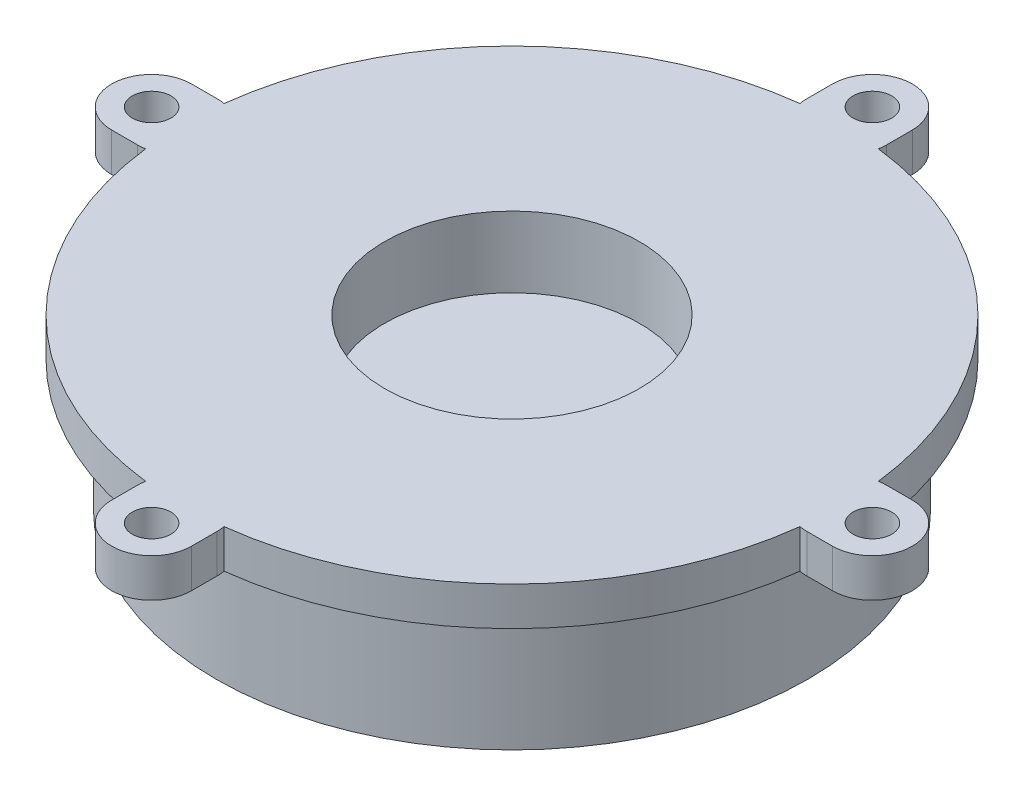
ISO-10303-21;
HEADER;
FILE_DESCRIPTION(('STEP AP214'),'2;1');
FILE_NAME('part.step','',(''),(''),'','','');
FILE_SCHEMA(('AUTOMOTIVE_DESIGN { 1 0 10303 214 1 1 1 1 }'));
ENDSEC;
DATA;
#1=APPLICATION_CONTEXT('core data for automotive mechanical design processes');
#2=APPLICATION_PROTOCOL_DEFINITION('international standard','automotive_design',2000,#1);
#3=PRODUCT_CONTEXT('',#1,'mechanical');
#4=PRODUCT('Part','Part','',(#3));
#5=PRODUCT_RELATED_PRODUCT_CATEGORY('part','',(#4));
#6=PRODUCT_DEFINITION_FORMATION('','',#4);
#7=PRODUCT_DEFINITION_CONTEXT('part definition',#1,'design');
#8=PRODUCT_DEFINITION('design','',#6,#7);
#9=PRODUCT_DEFINITION_SHAPE('','',#8);
#10=(LENGTH_UNIT() NAMED_UNIT(*) SI_UNIT(.MILLI.,.METRE.));
#11=(NAMED_UNIT(*) PLANE_ANGLE_UNIT() SI_UNIT($,.RADIAN.));
#12=(NAMED_UNIT(*) SI_UNIT($,.STERADIAN.) SOLID_ANGLE_UNIT());
#13=UNCERTAINTY_MEASURE_WITH_UNIT(LENGTH_MEASURE(1.E-05),#10,'distance_accuracy_value','');
#14=(GEOMETRIC_REPRESENTATION_CONTEXT(3) GLOBAL_UNCERTAINTY_ASSIGNED_CONTEXT((#13)) GLOBAL_UNIT_ASSIGNED_CONTEXT((#10,
#11,#12)) REPRESENTATION_CONTEXT('',''));
#15=CARTESIAN_POINT('',(0.,0.,0.));
#16=DIRECTION('',(0.,0.,1.));
#17=DIRECTION('',(1.,0.,0.));
#18=AXIS2_PLACEMENT_3D('',#15,#16,#17);
#19=CARTESIAN_POINT('',(0.,21.,5.90132241946489));
#20=DIRECTION('',(0.,0.,1.));
#21=DIRECTION('',(1.,0.,0.));
#22=AXIS2_PLACEMENT_3D('',#19,#20,#21);
#23=PLANE('',#22);
#24=DIRECTION('',(-1.,0.,0.));
#25=VECTOR('',#24,1.);
#26=CARTESIAN_POINT('',(0.,20.,5.90132241946489));
#27=LINE('',#26,#25);
#28=CARTESIAN_POINT('',(13.9237585528717,20.,5.90132241946488));
#29=VERTEX_POINT('',#28);
#30=CARTESIAN_POINT('',(11.9237585528717,20.,5.90132241946488));
#31=VERTEX_POINT('',#30);
#32=EDGE_CURVE('E319',#29,#31,#27,.T.);
#33=ORIENTED_EDGE('',*,*,#32,.T.);
#34=DIRECTION('',(0.,-1.,0.));
#35=VECTOR('',#34,1.);
#36=CARTESIAN_POINT('',(11.9237585528717,21.,5.90132241946488));
#37=LINE('',#36,#35);
#38=CARTESIAN_POINT('',(11.9237585528717,23.,5.90132241946488));
#39=VERTEX_POINT('',#38);
#40=EDGE_CURVE('E51',#39,#31,#37,.T.);
#41=ORIENTED_EDGE('',*,*,#40,.F.);
#42=DIRECTION('',(-1.,0.,0.));
#43=VECTOR('',#42,1.);
#44=CARTESIAN_POINT('',(13.9237585528717,23.,5.90132241946488));
#45=LINE('',#44,#43);
#46=CARTESIAN_POINT('',(13.9237585528717,23.,5.90132241946488));
#47=VERTEX_POINT('',#46);
#48=EDGE_CURVE('E211',#47,#39,#45,.T.);
#49=ORIENTED_EDGE('',*,*,#48,.F.);
#50=DIRECTION('',(0.,-1.,0.));
#51=VECTOR('',#50,1.);
#52=CARTESIAN_POINT('',(13.9237585528717,21.,5.90132241946488));
#53=LINE('',#52,#51);
#54=EDGE_CURVE('E199',#47,#29,#53,.T.);
#55=ORIENTED_EDGE('',*,*,#54,.T.);
#56=EDGE_LOOP('',(#33,#41,#49,#55));
#57=FACE_BOUND('',#56,.T.);
#58=ADVANCED_FACE('F41',(#57),#23,.F.);
#59=CARTESIAN_POINT('',(11.9237585528717,21.,9.00132241946488));
#60=DIRECTION('',(0.,-1.,0.));
#61=DIRECTION('',(0.,0.,-1.));
#62=AXIS2_PLACEMENT_3D('',#59,#60,#61);
#63=CYLINDRICAL_SURFACE('',#62,3.1);
#64=CARTESIAN_POINT('',(11.9237585528717,20.,9.00132241946488));
#65=DIRECTION('',(0.,1.,0.));
#66=DIRECTION('',(0.,0.,1.));
#67=AXIS2_PLACEMENT_3D('',#64,#65,#66);
#68=CIRCLE('',#67,3.1);
#69=CARTESIAN_POINT('',(11.342027783641,20.,5.95639396182746));
#70=VERTEX_POINT('',#69);
#71=EDGE_CURVE('E322',#31,#70,#68,.T.);
#72=ORIENTED_EDGE('',*,*,#71,.T.);
#73=DIRECTION('',(0.,-1.,0.));
#74=VECTOR('',#73,1.);
#75=CARTESIAN_POINT('',(11.342027783641,21.,5.95639396182746));
#76=LINE('',#75,#74);
#77=CARTESIAN_POINT('',(11.342027783641,23.,5.95639396182746));
#78=VERTEX_POINT('',#77);
#79=EDGE_CURVE('E469',#78,#70,#76,.T.);
#80=ORIENTED_EDGE('',*,*,#79,.F.);
#81=CARTESIAN_POINT('',(11.9237585528717,23.,9.00132241946488));
#82=DIRECTION('',(0.,1.,0.));
#83=DIRECTION('',(0.,0.,1.));
#84=AXIS2_PLACEMENT_3D('',#81,#82,#83);
#85=CIRCLE('',#84,3.1);
#86=EDGE_CURVE('E217',#39,#78,#85,.T.);
#87=ORIENTED_EDGE('',*,*,#86,.F.);
#88=ORIENTED_EDGE('',*,*,#40,.T.);
#89=EDGE_LOOP('',(#72,#80,#87,#88));
#90=FACE_BOUND('',#89,.T.);
#91=ADVANCED_FACE('F475',(#90),#63,.T.);
#92=CARTESIAN_POINT('',(-14.0762414471283,21.,9.00132241946489));
#93=DIRECTION('',(0.,-1.,0.));
#94=DIRECTION('',(0.,0.,-1.));
#95=AXIS2_PLACEMENT_3D('',#92,#93,#94);
#96=CYLINDRICAL_SURFACE('',#95,25.6);
#97=CARTESIAN_POINT('',(-14.0762414471283,20.,9.00132241946489));
#98=DIRECTION('',(0.,1.,0.));
#99=DIRECTION('',(0.,0.,1.));
#100=AXIS2_PLACEMENT_3D('',#97,#98,#99);
#101=CIRCLE('',#100,25.6);
#102=CARTESIAN_POINT('',(-11.0313129894909,20.,-16.4169468113043));
#103=VERTEX_POINT('',#102);
#104=EDGE_CURVE('E325',#70,#103,#101,.T.);
#105=ORIENTED_EDGE('',*,*,#104,.T.);
#106=DIRECTION('',(0.,-1.,0.));
#107=VECTOR('',#106,1.);
#108=CARTESIAN_POINT('',(-11.0313129894909,21.,-16.4169468113043));
#109=LINE('',#108,#107);
#110=CARTESIAN_POINT('',(-11.0313129894909,23.,-16.4169468113043));
#111=VERTEX_POINT('',#110);
#112=EDGE_CURVE('E465',#111,#103,#109,.T.);
#113=ORIENTED_EDGE('',*,*,#112,.F.);
#114=CARTESIAN_POINT('',(-14.0762414471283,23.,9.00132241946489));
#115=DIRECTION('',(0.,1.,0.));
#116=DIRECTION('',(0.,0.,1.));
#117=AXIS2_PLACEMENT_3D('',#114,#115,#116);
#118=CIRCLE('',#117,25.6);
#119=EDGE_CURVE('E234',#78,#111,#118,.T.);
#120=ORIENTED_EDGE('',*,*,#119,.F.);
#121=ORIENTED_EDGE('',*,*,#79,.T.);
#122=EDGE_LOOP('',(#105,#113,#120,#121));
#123=FACE_BOUND('',#122,.T.);
#124=ADVANCED_FACE('F484',(#123),#96,.T.);
#125=CARTESIAN_POINT('',(-14.0762414471283,21.,-16.9986775805351));
#126=DIRECTION('',(0.,-1.,0.));
#127=DIRECTION('',(0.,0.,-1.));
#128=AXIS2_PLACEMENT_3D('',#125,#126,#127);
#129=CYLINDRICAL_SURFACE('',#128,3.10000000000001);
#130=CARTESIAN_POINT('',(-14.0762414471283,20.,-16.9986775805351));
#131=DIRECTION('',(0.,1.,0.));
#132=DIRECTION('',(0.,0.,1.));
#133=AXIS2_PLACEMENT_3D('',#130,#131,#132);
#134=CIRCLE('',#133,3.10000000000001);
#135=CARTESIAN_POINT('',(-10.9762414471283,20.,-16.9986775805351));
#136=VERTEX_POINT('',#135);
#137=EDGE_CURVE('E329',#103,#136,#134,.T.);
#138=ORIENTED_EDGE('',*,*,#137,.T.);
#139=DIRECTION('',(0.,-1.,0.));
#140=VECTOR('',#139,1.);
#141=CARTESIAN_POINT('',(-10.9762414471283,21.,-16.9986775805351));
#142=LINE('',#141,#140);
#143=CARTESIAN_POINT('',(-10.9762414471283,23.,-16.9986775805351));
#144=VERTEX_POINT('',#143);
#145=EDGE_CURVE('E461',#144,#136,#142,.T.);
#146=ORIENTED_EDGE('',*,*,#145,.F.);
#147=CARTESIAN_POINT('',(-14.0762414471283,23.,-16.9986775805351));
#148=DIRECTION('',(0.,1.,0.));
#149=DIRECTION('',(0.,0.,1.));
#150=AXIS2_PLACEMENT_3D('',#147,#148,#149);
#151=CIRCLE('',#150,3.1);
#152=EDGE_CURVE('E238',#111,#144,#151,.T.);
#153=ORIENTED_EDGE('',*,*,#152,.F.);
#154=ORIENTED_EDGE('',*,*,#112,.T.);
#155=EDGE_LOOP('',(#138,#146,#153,#154));
#156=FACE_BOUND('',#155,.T.);
#157=ADVANCED_FACE('F488',(#156),#129,.T.);
#158=CARTESIAN_POINT('',(-10.9762414471283,21.,0.));
#159=DIRECTION('',(-1.,0.,0.));
#160=DIRECTION('',(0.,0.,1.));
#161=AXIS2_PLACEMENT_3D('',#158,#159,#160);
#162=PLANE('',#161);
#163=DIRECTION('',(0.,0.,-1.));
#164=VECTOR('',#163,1.);
#165=CARTESIAN_POINT('',(-10.9762414471283,20.,0.));
#166=LINE('',#165,#164);
#167=CARTESIAN_POINT('',(-10.9762414471283,20.,-18.9986775805351));
#168=VERTEX_POINT('',#167);
#169=EDGE_CURVE('E334',#136,#168,#166,.T.);
#170=ORIENTED_EDGE('',*,*,#169,.T.);
#171=DIRECTION('',(0.,-1.,0.));
#172=VECTOR('',#171,1.);
#173=CARTESIAN_POINT('',(-10.9762414471283,21.,-18.9986775805351));
#174=LINE('',#173,#172);
#175=CARTESIAN_POINT('',(-10.9762414471283,23.,-18.9986775805351));
#176=VERTEX_POINT('',#175);
#177=EDGE_CURVE('E457',#176,#168,#174,.T.);
#178=ORIENTED_EDGE('',*,*,#177,.F.);
#179=DIRECTION('',(0.,0.,-1.));
#180=VECTOR('',#179,1.);
#181=CARTESIAN_POINT('',(-10.9762414471283,23.,-16.9986775805351));
#182=LINE('',#181,#180);
#183=EDGE_CURVE('E242',#144,#176,#182,.T.);
#184=ORIENTED_EDGE('',*,*,#183,.F.);
#185=ORIENTED_EDGE('',*,*,#145,.T.);
#186=EDGE_LOOP('',(#170,#178,#184,#185));
#187=FACE_BOUND('',#186,.T.);
#188=ADVANCED_FACE('F492',(#187),#162,.F.);
#189=CARTESIAN_POINT('',(-14.0762414471283,21.,-18.9986775805351));
#190=DIRECTION('',(0.,-1.,0.));
#191=DIRECTION('',(0.,0.,-1.));
#192=AXIS2_PLACEMENT_3D('',#189,#190,#191);
#193=CYLINDRICAL_SURFACE('',#192,3.10000000000001);
#194=CARTESIAN_POINT('',(-14.0762414471283,20.,-18.9986775805351));
#195=DIRECTION('',(0.,1.,0.));
#196=DIRECTION('',(0.,0.,1.));
#197=AXIS2_PLACEMENT_3D('',#194,#195,#196);
#198=CIRCLE('',#197,3.10000000000001);
#199=CARTESIAN_POINT('',(-17.1762414471283,20.,-18.9986775805351));
#200=VERTEX_POINT('',#199);
#201=EDGE_CURVE('E338',#168,#200,#198,.T.);
#202=ORIENTED_EDGE('',*,*,#201,.T.);
#203=DIRECTION('',(0.,-1.,0.));
#204=VECTOR('',#203,1.);
#205=CARTESIAN_POINT('',(-17.1762414471283,21.,-18.9986775805351));
#206=LINE('',#205,#204);
#207=CARTESIAN_POINT('',(-17.1762414471283,23.,-18.9986775805351));
#208=VERTEX_POINT('',#207);
#209=EDGE_CURVE('E454',#208,#200,#206,.T.);
#210=ORIENTED_EDGE('',*,*,#209,.F.);
#211=CARTESIAN_POINT('',(-14.0762414471283,23.,-18.9986775805351));
#212=DIRECTION('',(0.,1.,0.));
#213=DIRECTION('',(0.,0.,1.));
#214=AXIS2_PLACEMENT_3D('',#211,#212,#213);
#215=CIRCLE('',#214,3.10000000000001);
#216=EDGE_CURVE('E246',#176,#208,#215,.T.);
#217=ORIENTED_EDGE('',*,*,#216,.F.);
#218=ORIENTED_EDGE('',*,*,#177,.T.);
#219=EDGE_LOOP('',(#202,#210,#217,#218));
#220=FACE_BOUND('',#219,.T.);
#221=ADVANCED_FACE('F495',(#220),#193,.T.);
#222=CARTESIAN_POINT('',(-17.1762414471283,21.,0.));
#223=DIRECTION('',(-1.,0.,0.));
#224=DIRECTION('',(0.,0.,1.));
#225=AXIS2_PLACEMENT_3D('',#222,#223,#224);
#226=PLANE('',#225);
#227=DIRECTION('',(0.,0.,-1.));
#228=VECTOR('',#227,1.);
#229=CARTESIAN_POINT('',(-17.1762414471283,20.,0.));
#230=LINE('',#229,#228);
#231=CARTESIAN_POINT('',(-17.1762414471283,20.,-16.9986775805351));
#232=VERTEX_POINT('',#231);
#233=EDGE_CURVE('E342',#232,#200,#230,.T.);
#234=ORIENTED_EDGE('',*,*,#233,.F.);
#235=DIRECTION('',(0.,-1.,0.));
#236=VECTOR('',#235,1.);
#237=CARTESIAN_POINT('',(-17.1762414471283,21.,-16.9986775805351));
#238=LINE('',#237,#236);
#239=CARTESIAN_POINT('',(-17.1762414471283,23.,-16.9986775805351));
#240=VERTEX_POINT('',#239);
#241=EDGE_CURVE('E451',#240,#232,#238,.T.);
#242=ORIENTED_EDGE('',*,*,#241,.F.);
#243=DIRECTION('',(0.,0.,1.));
#244=VECTOR('',#243,1.);
#245=CARTESIAN_POINT('',(-17.1762414471283,23.,-18.9986775805351));
#246=LINE('',#245,#244);
#247=EDGE_CURVE('E250',#208,#240,#246,.T.);
#248=ORIENTED_EDGE('',*,*,#247,.F.);
#249=ORIENTED_EDGE('',*,*,#209,.T.);
#250=EDGE_LOOP('',(#234,#242,#248,#249));
#251=FACE_BOUND('',#250,.T.);
#252=ADVANCED_FACE('F500',(#251),#226,.T.);
#253=CARTESIAN_POINT('',(-17.1211699047657,20.,-16.4169468113043));
#254=VERTEX_POINT('',#253);
#255=EDGE_CURVE('E335',#232,#254,#134,.T.);
#256=ORIENTED_EDGE('',*,*,#255,.T.);
#257=DIRECTION('',(0.,-1.,0.));
#258=VECTOR('',#257,1.);
#259=CARTESIAN_POINT('',(-17.1211699047657,21.,-16.4169468113043));
#260=LINE('',#259,#258);
#261=CARTESIAN_POINT('',(-17.1211699047657,23.,-16.4169468113043));
#262=VERTEX_POINT('',#261);
#263=EDGE_CURVE('E447',#262,#254,#260,.T.);
#264=ORIENTED_EDGE('',*,*,#263,.F.);
#265=CARTESIAN_POINT('',(-14.0762414471283,23.,-16.9986775805351));
#266=DIRECTION('',(0.,1.,0.));
#267=DIRECTION('',(0.,0.,1.));
#268=AXIS2_PLACEMENT_3D('',#265,#266,#267);
#269=CIRCLE('',#268,3.10000000000001);
#270=EDGE_CURVE('E254',#240,#262,#269,.T.);
#271=ORIENTED_EDGE('',*,*,#270,.F.);
#272=ORIENTED_EDGE('',*,*,#241,.T.);
#273=EDGE_LOOP('',(#256,#264,#271,#272));
#274=FACE_BOUND('',#273,.T.);
#275=ADVANCED_FACE('F505',(#274),#129,.T.);
#276=CARTESIAN_POINT('',(-39.4945106778975,20.,5.95639396182747));
#277=VERTEX_POINT('',#276);
#278=EDGE_CURVE('E331',#254,#277,#101,.T.);
#279=ORIENTED_EDGE('',*,*,#278,.T.);
#280=DIRECTION('',(0.,-1.,0.));
#281=VECTOR('',#280,1.);
#282=CARTESIAN_POINT('',(-39.4945106778975,21.,5.95639396182747));
#283=LINE('',#282,#281);
#284=CARTESIAN_POINT('',(-39.4945106778975,23.,5.95639396182747));
#285=VERTEX_POINT('',#284);
#286=EDGE_CURVE('E443',#285,#277,#283,.T.);
#287=ORIENTED_EDGE('',*,*,#286,.F.);
#288=CARTESIAN_POINT('',(-14.0762414471283,23.,9.00132241946489));
#289=DIRECTION('',(0.,1.,0.));
#290=DIRECTION('',(0.,0.,1.));
#291=AXIS2_PLACEMENT_3D('',#288,#289,#290);
#292=CIRCLE('',#291,25.6);
#293=EDGE_CURVE('E258',#262,#285,#292,.T.);
#294=ORIENTED_EDGE('',*,*,#293,.F.);
#295=ORIENTED_EDGE('',*,*,#263,.T.);
#296=EDGE_LOOP('',(#279,#287,#294,#295));
#297=FACE_BOUND('',#296,.T.);
#298=ADVANCED_FACE('F507',(#297),#96,.T.);
#299=CARTESIAN_POINT('',(-40.0762414471283,21.,9.00132241946489));
#300=DIRECTION('',(0.,-1.,0.));
#301=DIRECTION('',(0.,0.,-1.));
#302=AXIS2_PLACEMENT_3D('',#299,#300,#301);
#303=CYLINDRICAL_SURFACE('',#302,3.1);
#304=CARTESIAN_POINT('',(-40.0762414471283,20.,9.00132241946489));
#305=DIRECTION('',(0.,1.,0.));
#306=DIRECTION('',(0.,0.,1.));
#307=AXIS2_PLACEMENT_3D('',#304,#305,#306);
#308=CIRCLE('',#307,3.1);
#309=CARTESIAN_POINT('',(-40.0762414471283,20.,5.90132241946489));
#310=VERTEX_POINT('',#309);
#311=EDGE_CURVE('E346',#277,#310,#308,.T.);
#312=ORIENTED_EDGE('',*,*,#311,.T.);
#313=DIRECTION('',(0.,-1.,0.));
#314=VECTOR('',#313,1.);
#315=CARTESIAN_POINT('',(-40.0762414471283,21.,5.90132241946489));
#316=LINE('',#315,#314);
#317=CARTESIAN_POINT('',(-40.0762414471283,23.,5.90132241946489));
#318=VERTEX_POINT('',#317);
#319=EDGE_CURVE('E439',#318,#310,#316,.T.);
#320=ORIENTED_EDGE('',*,*,#319,.F.);
#321=CARTESIAN_POINT('',(-40.0762414471283,23.,9.00132241946489));
#322=DIRECTION('',(0.,1.,0.));
#323=DIRECTION('',(0.,0.,1.));
#324=AXIS2_PLACEMENT_3D('',#321,#322,#323);
#325=CIRCLE('',#324,3.1);
#326=EDGE_CURVE('E262',#285,#318,#325,.T.);
#327=ORIENTED_EDGE('',*,*,#326,.F.);
#328=ORIENTED_EDGE('',*,*,#286,.T.);
#329=EDGE_LOOP('',(#312,#320,#327,#328));
#330=FACE_BOUND('',#329,.T.);
#331=ADVANCED_FACE('F562',(#330),#303,.T.);
#332=CARTESIAN_POINT('',(0.,21.,5.90132241946483));
#333=DIRECTION('',(0.,0.,1.));
#334=DIRECTION('',(1.,0.,0.));
#335=AXIS2_PLACEMENT_3D('',#332,#333,#334);
#336=PLANE('',#335);
#337=DIRECTION('',(-1.,0.,0.));
#338=VECTOR('',#337,1.);
#339=CARTESIAN_POINT('',(0.,20.,5.90132241946483));
#340=LINE('',#339,#338);
#341=CARTESIAN_POINT('',(-42.0762414471283,20.,5.90132241946489));
#342=VERTEX_POINT('',#341);
#343=EDGE_CURVE('E349',#310,#342,#340,.T.);
#344=ORIENTED_EDGE('',*,*,#343,.T.);
#345=DIRECTION('',(0.,-1.,0.));
#346=VECTOR('',#345,1.);
#347=CARTESIAN_POINT('',(-42.0762414471283,21.,5.90132241946489));
#348=LINE('',#347,#346);
#349=CARTESIAN_POINT('',(-42.0762414471283,23.,5.90132241946489));
#350=VERTEX_POINT('',#349);
#351=EDGE_CURVE('E435',#350,#342,#348,.T.);
#352=ORIENTED_EDGE('',*,*,#351,.F.);
#353=DIRECTION('',(-1.,0.,0.));
#354=VECTOR('',#353,1.);
#355=CARTESIAN_POINT('',(-40.0762414471283,23.,5.90132241946489));
#356=LINE('',#355,#354);
#357=EDGE_CURVE('E266',#318,#350,#356,.T.);
#358=ORIENTED_EDGE('',*,*,#357,.F.);
#359=ORIENTED_EDGE('',*,*,#319,.T.);
#360=EDGE_LOOP('',(#344,#352,#358,#359));
#361=FACE_BOUND('',#360,.T.);
#362=ADVANCED_FACE('F558',(#361),#336,.F.);
#363=CARTESIAN_POINT('',(-42.0762414471283,21.,9.00132241946489));
#364=DIRECTION('',(0.,-1.,0.));
#365=DIRECTION('',(0.,0.,-1.));
#366=AXIS2_PLACEMENT_3D('',#363,#364,#365);
#367=CYLINDRICAL_SURFACE('',#366,3.1);
#368=CARTESIAN_POINT('',(-42.0762414471283,20.,9.00132241946489));
#369=DIRECTION('',(0.,1.,0.));
#370=DIRECTION('',(0.,0.,1.));
#371=AXIS2_PLACEMENT_3D('',#368,#369,#370);
#372=CIRCLE('',#371,3.1);
#373=CARTESIAN_POINT('',(-42.0762414471283,20.,12.1013224194649));
#374=VERTEX_POINT('',#373);
#375=EDGE_CURVE('E353',#342,#374,#372,.T.);
#376=ORIENTED_EDGE('',*,*,#375,.T.);
#377=DIRECTION('',(0.,-1.,0.));
#378=VECTOR('',#377,1.);
#379=CARTESIAN_POINT('',(-42.0762414471283,21.,12.1013224194649));
#380=LINE('',#379,#378);
#381=CARTESIAN_POINT('',(-42.0762414471283,23.,12.1013224194649));
#382=VERTEX_POINT('',#381);
#383=EDGE_CURVE('E432',#382,#374,#380,.T.);
#384=ORIENTED_EDGE('',*,*,#383,.F.);
#385=CARTESIAN_POINT('',(-42.0762414471283,23.,9.00132241946489));
#386=DIRECTION('',(0.,1.,0.));
#387=DIRECTION('',(0.,0.,1.));
#388=AXIS2_PLACEMENT_3D('',#385,#386,#387);
#389=CIRCLE('',#388,3.1);
#390=EDGE_CURVE('E270',#350,#382,#389,.T.);
#391=ORIENTED_EDGE('',*,*,#390,.F.);
#392=ORIENTED_EDGE('',*,*,#351,.T.);
#393=EDGE_LOOP('',(#376,#384,#391,#392));
#394=FACE_BOUND('',#393,.T.);
#395=ADVANCED_FACE('F556',(#394),#367,.T.);
#396=CARTESIAN_POINT('',(0.,21.,12.1013224194649));
#397=DIRECTION('',(0.,0.,1.));
#398=DIRECTION('',(1.,0.,0.));
#399=AXIS2_PLACEMENT_3D('',#396,#397,#398);
#400=PLANE('',#399);
#401=DIRECTION('',(-1.,0.,0.));
#402=VECTOR('',#401,1.);
#403=CARTESIAN_POINT('',(0.,20.,12.1013224194649));
#404=LINE('',#403,#402);
#405=CARTESIAN_POINT('',(-40.0762414471283,20.,12.1013224194649));
#406=VERTEX_POINT('',#405);
#407=EDGE_CURVE('E357',#406,#374,#404,.T.);
#408=ORIENTED_EDGE('',*,*,#407,.F.);
#409=DIRECTION('',(0.,-1.,0.));
#410=VECTOR('',#409,1.);
#411=CARTESIAN_POINT('',(-40.0762414471283,21.,12.1013224194649));
#412=LINE('',#411,#410);
#413=CARTESIAN_POINT('',(-40.0762414471283,23.,12.1013224194649));
#414=VERTEX_POINT('',#413);
#415=EDGE_CURVE('E429',#414,#406,#412,.T.);
#416=ORIENTED_EDGE('',*,*,#415,.F.);
#417=DIRECTION('',(1.,0.,0.));
#418=VECTOR('',#417,1.);
#419=CARTESIAN_POINT('',(-42.0762414471283,23.,12.1013224194649));
#420=LINE('',#419,#418);
#421=EDGE_CURVE('E274',#382,#414,#420,.T.);
#422=ORIENTED_EDGE('',*,*,#421,.F.);
#423=ORIENTED_EDGE('',*,*,#383,.T.);
#424=EDGE_LOOP('',(#408,#416,#422,#423));
#425=FACE_BOUND('',#424,.T.);
#426=ADVANCED_FACE('F552',(#425),#400,.T.);
#427=CARTESIAN_POINT('',(-39.4945106778975,20.,12.0462508771023));
#428=VERTEX_POINT('',#427);
#429=EDGE_CURVE('E350',#406,#428,#308,.T.);
#430=ORIENTED_EDGE('',*,*,#429,.T.);
#431=DIRECTION('',(0.,-1.,0.));
#432=VECTOR('',#431,1.);
#433=CARTESIAN_POINT('',(-39.4945106778975,21.,12.0462508771023));
#434=LINE('',#433,#432);
#435=CARTESIAN_POINT('',(-39.4945106778975,23.,12.0462508771023));
#436=VERTEX_POINT('',#435);
#437=EDGE_CURVE('E425',#436,#428,#434,.T.);
#438=ORIENTED_EDGE('',*,*,#437,.F.);
#439=CARTESIAN_POINT('',(-40.0762414471283,23.,9.00132241946489));
#440=DIRECTION('',(0.,1.,0.));
#441=DIRECTION('',(0.,0.,1.));
#442=AXIS2_PLACEMENT_3D('',#439,#440,#441);
#443=CIRCLE('',#442,3.1);
#444=EDGE_CURVE('E278',#414,#436,#443,.T.);
#445=ORIENTED_EDGE('',*,*,#444,.F.);
#446=ORIENTED_EDGE('',*,*,#415,.T.);
#447=EDGE_LOOP('',(#430,#438,#445,#446));
#448=FACE_BOUND('',#447,.T.);
#449=ADVANCED_FACE('F565',(#448),#303,.T.);
#450=CARTESIAN_POINT('',(-17.1211699047657,20.,34.4195916502341));
#451=VERTEX_POINT('',#450);
#452=EDGE_CURVE('E366',#428,#451,#101,.T.);
#453=ORIENTED_EDGE('',*,*,#452,.T.);
#454=DIRECTION('',(0.,-1.,0.));
#455=VECTOR('',#454,1.);
#456=CARTESIAN_POINT('',(-17.1211699047657,21.,34.4195916502341));
#457=LINE('',#456,#455);
#458=CARTESIAN_POINT('',(-17.1211699047657,23.,34.4195916502341));
#459=VERTEX_POINT('',#458);
#460=EDGE_CURVE('E421',#459,#451,#457,.T.);
#461=ORIENTED_EDGE('',*,*,#460,.F.);
#462=CARTESIAN_POINT('',(-14.0762414471283,23.,9.00132241946489));
#463=DIRECTION('',(0.,1.,0.));
#464=DIRECTION('',(0.,0.,1.));
#465=AXIS2_PLACEMENT_3D('',#462,#463,#464);
#466=CIRCLE('',#465,25.6);
#467=EDGE_CURVE('E282',#436,#459,#466,.T.);
#468=ORIENTED_EDGE('',*,*,#467,.F.);
#469=ORIENTED_EDGE('',*,*,#437,.T.);
#470=EDGE_LOOP('',(#453,#461,#468,#469));
#471=FACE_BOUND('',#470,.T.);
#472=ADVANCED_FACE('F566',(#471),#96,.T.);
#473=CARTESIAN_POINT('',(-14.0762414471283,21.,35.0013224194649));
#474=DIRECTION('',(0.,-1.,0.));
#475=DIRECTION('',(0.,0.,-1.));
#476=AXIS2_PLACEMENT_3D('',#473,#474,#475);
#477=CYLINDRICAL_SURFACE('',#476,3.10000000000001);
#478=CARTESIAN_POINT('',(-14.0762414471283,20.,35.0013224194649));
#479=DIRECTION('',(0.,1.,0.));
#480=DIRECTION('',(0.,0.,1.));
#481=AXIS2_PLACEMENT_3D('',#478,#479,#480);
#482=CIRCLE('',#481,3.10000000000001);
#483=CARTESIAN_POINT('',(-17.1762414471283,20.,35.0013224194649));
#484=VERTEX_POINT('',#483);
#485=EDGE_CURVE('E361',#451,#484,#482,.T.);
#486=ORIENTED_EDGE('',*,*,#485,.T.);
#487=DIRECTION('',(0.,-1.,0.));
#488=VECTOR('',#487,1.);
#489=CARTESIAN_POINT('',(-17.1762414471283,21.,35.0013224194649));
#490=LINE('',#489,#488);
#491=CARTESIAN_POINT('',(-17.1762414471283,23.,35.0013224194649));
#492=VERTEX_POINT('',#491);
#493=EDGE_CURVE('E418',#492,#484,#490,.T.);
#494=ORIENTED_EDGE('',*,*,#493,.F.);
#495=CARTESIAN_POINT('',(-14.0762414471283,23.,35.0013224194649));
#496=DIRECTION('',(0.,1.,0.));
#497=DIRECTION('',(0.,0.,1.));
#498=AXIS2_PLACEMENT_3D('',#495,#496,#497);
#499=CIRCLE('',#498,3.10000000000001);
#500=EDGE_CURVE('E286',#459,#492,#499,.T.);
#501=ORIENTED_EDGE('',*,*,#500,.F.);
#502=ORIENTED_EDGE('',*,*,#460,.T.);
#503=EDGE_LOOP('',(#486,#494,#501,#502));
#504=FACE_BOUND('',#503,.T.);
#505=ADVANCED_FACE('F546',(#504),#477,.T.);
#506=CARTESIAN_POINT('',(-17.1762414471283,21.,0.));
#507=DIRECTION('',(-1.,0.,0.));
#508=DIRECTION('',(0.,0.,1.));
#509=AXIS2_PLACEMENT_3D('',#506,#507,#508);
#510=PLANE('',#509);
#511=DIRECTION('',(0.,0.,-1.));
#512=VECTOR('',#511,1.);
#513=CARTESIAN_POINT('',(-17.1762414471283,20.,0.));
#514=LINE('',#513,#512);
#515=CARTESIAN_POINT('',(-17.1762414471283,20.,37.0013224194649));
#516=VERTEX_POINT('',#515);
#517=EDGE_CURVE('E365',#516,#484,#514,.T.);
#518=ORIENTED_EDGE('',*,*,#517,.F.);
#519=DIRECTION('',(0.,-1.,0.));
#520=VECTOR('',#519,1.);
#521=CARTESIAN_POINT('',(-17.1762414471283,21.,37.0013224194649));
#522=LINE('',#521,#520);
#523=CARTESIAN_POINT('',(-17.1762414471283,23.,37.0013224194649));
#524=VERTEX_POINT('',#523);
#525=EDGE_CURVE('E415',#524,#516,#522,.T.);
#526=ORIENTED_EDGE('',*,*,#525,.F.);
#527=DIRECTION('',(0.,0.,1.));
#528=VECTOR('',#527,1.);
#529=CARTESIAN_POINT('',(-17.1762414471283,23.,35.0013224194649));
#530=LINE('',#529,#528);
#531=EDGE_CURVE('E290',#492,#524,#530,.T.);
#532=ORIENTED_EDGE('',*,*,#531,.F.);
#533=ORIENTED_EDGE('',*,*,#493,.T.);
#534=EDGE_LOOP('',(#518,#526,#532,#533));
#535=FACE_BOUND('',#534,.T.);
#536=ADVANCED_FACE('F542',(#535),#510,.T.);
#537=CARTESIAN_POINT('',(-14.0762414471283,21.,37.0013224194649));
#538=DIRECTION('',(0.,-1.,0.));
#539=DIRECTION('',(0.,0.,-1.));
#540=AXIS2_PLACEMENT_3D('',#537,#538,#539);
#541=CYLINDRICAL_SURFACE('',#540,3.10000000000001);
#542=CARTESIAN_POINT('',(-14.0762414471283,20.,37.0013224194649));
#543=DIRECTION('',(0.,1.,0.));
#544=DIRECTION('',(0.,0.,1.));
#545=AXIS2_PLACEMENT_3D('',#542,#543,#544);
#546=CIRCLE('',#545,3.10000000000001);
#547=CARTESIAN_POINT('',(-10.9762414471283,20.,37.0013224194649));
#548=VERTEX_POINT('',#547);
#549=EDGE_CURVE('E371',#516,#548,#546,.T.);
#550=ORIENTED_EDGE('',*,*,#549,.T.);
#551=DIRECTION('',(0.,-1.,0.));
#552=VECTOR('',#551,1.);
#553=CARTESIAN_POINT('',(-10.9762414471283,21.,37.0013224194649));
#554=LINE('',#553,#552);
#555=CARTESIAN_POINT('',(-10.9762414471283,23.,37.0013224194649));
#556=VERTEX_POINT('',#555);
#557=EDGE_CURVE('E411',#556,#548,#554,.T.);
#558=ORIENTED_EDGE('',*,*,#557,.F.);
#559=CARTESIAN_POINT('',(-14.0762414471283,23.,37.0013224194649));
#560=DIRECTION('',(0.,1.,0.));
#561=DIRECTION('',(0.,0.,1.));
#562=AXIS2_PLACEMENT_3D('',#559,#560,#561);
#563=CIRCLE('',#562,3.10000000000001);
#564=EDGE_CURVE('E294',#524,#556,#563,.T.);
#565=ORIENTED_EDGE('',*,*,#564,.F.);
#566=ORIENTED_EDGE('',*,*,#525,.T.);
#567=EDGE_LOOP('',(#550,#558,#565,#566));
#568=FACE_BOUND('',#567,.T.);
#569=ADVANCED_FACE('F567',(#568),#541,.T.);
#570=CARTESIAN_POINT('',(-10.9762414471283,21.,0.));
#571=DIRECTION('',(-1.,0.,0.));
#572=DIRECTION('',(0.,0.,1.));
#573=AXIS2_PLACEMENT_3D('',#570,#571,#572);
#574=PLANE('',#573);
#575=DIRECTION('',(0.,0.,-1.));
#576=VECTOR('',#575,1.);
#577=CARTESIAN_POINT('',(-10.9762414471283,20.,0.));
#578=LINE('',#577,#576);
#579=CARTESIAN_POINT('',(-10.9762414471283,20.,35.0013224194649));
#580=VERTEX_POINT('',#579);
#581=EDGE_CURVE('E374',#548,#580,#578,.T.);
#582=ORIENTED_EDGE('',*,*,#581,.T.);
#583=DIRECTION('',(0.,-1.,0.));
#584=VECTOR('',#583,1.);
#585=CARTESIAN_POINT('',(-10.9762414471283,21.,35.0013224194649));
#586=LINE('',#585,#584);
#587=CARTESIAN_POINT('',(-10.9762414471283,23.,35.0013224194649));
#588=VERTEX_POINT('',#587);
#589=EDGE_CURVE('E407',#588,#580,#586,.T.);
#590=ORIENTED_EDGE('',*,*,#589,.F.);
#591=DIRECTION('',(0.,0.,-1.));
#592=VECTOR('',#591,1.);
#593=CARTESIAN_POINT('',(-10.9762414471283,23.,37.0013224194649));
#594=LINE('',#593,#592);
#595=EDGE_CURVE('E298',#556,#588,#594,.T.);
#596=ORIENTED_EDGE('',*,*,#595,.F.);
#597=ORIENTED_EDGE('',*,*,#557,.T.);
#598=EDGE_LOOP('',(#582,#590,#596,#597));
#599=FACE_BOUND('',#598,.T.);
#600=ADVANCED_FACE('F536',(#599),#574,.F.);
#601=CARTESIAN_POINT('',(-11.0313129894908,20.,34.4195916502341));
#602=VERTEX_POINT('',#601);
#603=EDGE_CURVE('E367',#580,#602,#482,.T.);
#604=ORIENTED_EDGE('',*,*,#603,.T.);
#605=DIRECTION('',(0.,-1.,0.));
#606=VECTOR('',#605,1.);
#607=CARTESIAN_POINT('',(-11.0313129894908,21.,34.4195916502341));
#608=LINE('',#607,#606);
#609=CARTESIAN_POINT('',(-11.0313129894908,23.,34.4195916502341));
#610=VERTEX_POINT('',#609);
#611=EDGE_CURVE('E403',#610,#602,#608,.T.);
#612=ORIENTED_EDGE('',*,*,#611,.F.);
#613=CARTESIAN_POINT('',(-14.0762414471283,23.,35.0013224194649));
#614=DIRECTION('',(0.,1.,0.));
#615=DIRECTION('',(0.,0.,1.));
#616=AXIS2_PLACEMENT_3D('',#613,#614,#615);
#617=CIRCLE('',#616,3.1);
#618=EDGE_CURVE('E302',#588,#610,#617,.T.);
#619=ORIENTED_EDGE('',*,*,#618,.F.);
#620=ORIENTED_EDGE('',*,*,#589,.T.);
#621=EDGE_LOOP('',(#604,#612,#619,#620));
#622=FACE_BOUND('',#621,.T.);
#623=ADVANCED_FACE('F524',(#622),#477,.T.);
#624=CARTESIAN_POINT('',(11.342027783641,20.,12.0462508771023));
#625=VERTEX_POINT('',#624);
#626=EDGE_CURVE('E330',#602,#625,#101,.T.);
#627=ORIENTED_EDGE('',*,*,#626,.T.);
#628=DIRECTION('',(0.,-1.,0.));
#629=VECTOR('',#628,1.);
#630=CARTESIAN_POINT('',(11.342027783641,21.,12.0462508771023));
#631=LINE('',#630,#629);
#632=CARTESIAN_POINT('',(11.342027783641,23.,12.0462508771023));
#633=VERTEX_POINT('',#632);
#634=EDGE_CURVE('E399',#633,#625,#631,.T.);
#635=ORIENTED_EDGE('',*,*,#634,.F.);
#636=CARTESIAN_POINT('',(-14.0762414471283,23.,9.00132241946489));
#637=DIRECTION('',(0.,1.,0.));
#638=DIRECTION('',(0.,0.,1.));
#639=AXIS2_PLACEMENT_3D('',#636,#637,#638);
#640=CIRCLE('',#639,25.6);
#641=EDGE_CURVE('E306',#610,#633,#640,.T.);
#642=ORIENTED_EDGE('',*,*,#641,.F.);
#643=ORIENTED_EDGE('',*,*,#611,.T.);
#644=EDGE_LOOP('',(#627,#635,#642,#643));
#645=FACE_BOUND('',#644,.T.);
#646=ADVANCED_FACE('F528',(#645),#96,.T.);
#647=CARTESIAN_POINT('',(11.9237585528717,20.,12.1013224194649));
#648=VERTEX_POINT('',#647);
#649=EDGE_CURVE('E326',#625,#648,#68,.T.);
#650=ORIENTED_EDGE('',*,*,#649,.T.);
#651=DIRECTION('',(0.,-1.,0.));
#652=VECTOR('',#651,1.);
#653=CARTESIAN_POINT('',(11.9237585528717,21.,12.1013224194649));
#654=LINE('',#653,#652);
#655=CARTESIAN_POINT('',(11.9237585528717,23.,12.1013224194649));
#656=VERTEX_POINT('',#655);
#657=EDGE_CURVE('E396',#656,#648,#654,.T.);
#658=ORIENTED_EDGE('',*,*,#657,.F.);
#659=CARTESIAN_POINT('',(11.9237585528717,23.,9.00132241946488));
#660=DIRECTION('',(0.,1.,0.));
#661=DIRECTION('',(0.,0.,1.));
#662=AXIS2_PLACEMENT_3D('',#659,#660,#661);
#663=CIRCLE('',#662,3.10000000000001);
#664=EDGE_CURVE('E310',#633,#656,#663,.T.);
#665=ORIENTED_EDGE('',*,*,#664,.F.);
#666=ORIENTED_EDGE('',*,*,#634,.T.);
#667=EDGE_LOOP('',(#650,#658,#665,#666));
#668=FACE_BOUND('',#667,.T.);
#669=ADVANCED_FACE('F531',(#668),#63,.T.);
#670=CARTESIAN_POINT('',(0.,21.,12.1013224194649));
#671=DIRECTION('',(0.,0.,1.));
#672=DIRECTION('',(1.,0.,0.));
#673=AXIS2_PLACEMENT_3D('',#670,#671,#672);
#674=PLANE('',#673);
#675=DIRECTION('',(-1.,0.,0.));
#676=VECTOR('',#675,1.);
#677=CARTESIAN_POINT('',(0.,20.,12.1013224194649));
#678=LINE('',#677,#676);
#679=CARTESIAN_POINT('',(13.9237585528717,20.,12.1013224194649));
#680=VERTEX_POINT('',#679);
#681=EDGE_CURVE('E377',#680,#648,#678,.T.);
#682=ORIENTED_EDGE('',*,*,#681,.F.);
#683=DIRECTION('',(0.,-1.,0.));
#684=VECTOR('',#683,1.);
#685=CARTESIAN_POINT('',(13.9237585528717,21.,12.1013224194649));
#686=LINE('',#685,#684);
#687=CARTESIAN_POINT('',(13.9237585528717,23.,12.1013224194649));
#688=VERTEX_POINT('',#687);
#689=EDGE_CURVE('E63',#688,#680,#686,.T.);
#690=ORIENTED_EDGE('',*,*,#689,.F.);
#691=DIRECTION('',(1.,0.,0.));
#692=VECTOR('',#691,1.);
#693=CARTESIAN_POINT('',(11.9237585528717,23.,12.1013224194649));
#694=LINE('',#693,#692);
#695=EDGE_CURVE('E223',#656,#688,#694,.T.);
#696=ORIENTED_EDGE('',*,*,#695,.F.);
#697=ORIENTED_EDGE('',*,*,#657,.T.);
#698=EDGE_LOOP('',(#682,#690,#696,#697));
#699=FACE_BOUND('',#698,.T.);
#700=ADVANCED_FACE('F617',(#699),#674,.T.);
#701=CARTESIAN_POINT('',(-42.0762414471283,21.,9.00132241946489));
#702=DIRECTION('',(0.,-1.,0.));
#703=DIRECTION('',(0.,0.,-1.));
#704=AXIS2_PLACEMENT_3D('',#701,#702,#703);
#705=CYLINDRICAL_SURFACE('',#704,1.5);
#706=CARTESIAN_POINT('',(-42.0762414471283,20.,9.00132241946489));
#707=DIRECTION('',(0.,1.,0.));
#708=DIRECTION('',(0.,0.,1.));
#709=AXIS2_PLACEMENT_3D('',#706,#707,#708);
#710=CIRCLE('',#709,1.5);
#711=CARTESIAN_POINT('',(-42.0762414471283,20.,10.5013224194649));
#712=VERTEX_POINT('',#711);
#713=EDGE_CURVE('E387',#712,#712,#710,.T.);
#714=ORIENTED_EDGE('',*,*,#713,.F.);
#715=EDGE_LOOP('',(#714));
#716=FACE_BOUND('',#715,.T.);
#717=CARTESIAN_POINT('',(-42.0762414471283,23.,9.00132241946489));
#718=DIRECTION('',(0.,-1.,0.));
#719=DIRECTION('',(0.,0.,-1.));
#720=AXIS2_PLACEMENT_3D('',#717,#718,#719);
#721=CIRCLE('',#720,1.5);
#722=CARTESIAN_POINT('',(-42.0762414471283,23.,7.50132241946488));
#723=VERTEX_POINT('',#722);
#724=EDGE_CURVE('E848',#723,#723,#721,.T.);
#725=ORIENTED_EDGE('',*,*,#724,.F.);
#726=EDGE_LOOP('',(#725));
#727=FACE_BOUND('',#726,.T.);
#728=ADVANCED_FACE('F668',(#716,#727),#705,.F.);
#729=CARTESIAN_POINT('',(-14.0762414471283,21.,37.0013224194649));
#730=DIRECTION('',(0.,-1.,0.));
#731=DIRECTION('',(0.,0.,-1.));
#732=AXIS2_PLACEMENT_3D('',#729,#730,#731);
#733=CYLINDRICAL_SURFACE('',#732,1.5);
#734=CARTESIAN_POINT('',(-14.0762414471283,20.,37.0013224194649));
#735=DIRECTION('',(0.,1.,0.));
#736=DIRECTION('',(0.,0.,1.));
#737=AXIS2_PLACEMENT_3D('',#734,#735,#736);
#738=CIRCLE('',#737,1.5);
#739=CARTESIAN_POINT('',(-14.0762414471283,20.,38.5013224194649));
#740=VERTEX_POINT('',#739);
#741=EDGE_CURVE('E383',#740,#740,#738,.T.);
#742=ORIENTED_EDGE('',*,*,#741,.F.);
#743=EDGE_LOOP('',(#742));
#744=FACE_BOUND('',#743,.T.);
#745=CARTESIAN_POINT('',(-14.0762414471283,23.,37.0013224194649));
#746=DIRECTION('',(0.,-1.,0.));
#747=DIRECTION('',(0.,0.,-1.));
#748=AXIS2_PLACEMENT_3D('',#745,#746,#747);
#749=CIRCLE('',#748,1.5);
#750=CARTESIAN_POINT('',(-14.0762414471283,23.,35.5013224194649));
#751=VERTEX_POINT('',#750);
#752=EDGE_CURVE('E225',#751,#751,#749,.T.);
#753=ORIENTED_EDGE('',*,*,#752,.F.);
#754=EDGE_LOOP('',(#753));
#755=FACE_BOUND('',#754,.T.);
#756=ADVANCED_FACE('F680',(#744,#755),#733,.F.);
#757=CARTESIAN_POINT('',(13.9237585528717,21.,9.00132241946489));
#758=DIRECTION('',(0.,-1.,0.));
#759=DIRECTION('',(0.,0.,-1.));
#760=AXIS2_PLACEMENT_3D('',#757,#758,#759);
#761=CYLINDRICAL_SURFACE('',#760,3.1);
#762=CARTESIAN_POINT('',(13.9237585528717,20.,9.00132241946489));
#763=DIRECTION('',(0.,1.,0.));
#764=DIRECTION('',(0.,0.,1.));
#765=AXIS2_PLACEMENT_3D('',#762,#763,#764);
#766=CIRCLE('',#765,3.1);
#767=EDGE_CURVE('E58',#680,#29,#766,.T.);
#768=ORIENTED_EDGE('',*,*,#767,.T.);
#769=ORIENTED_EDGE('',*,*,#54,.F.);
#770=CARTESIAN_POINT('',(13.9237585528717,23.,9.00132241946489));
#771=DIRECTION('',(0.,1.,0.));
#772=DIRECTION('',(0.,0.,1.));
#773=AXIS2_PLACEMENT_3D('',#770,#771,#772);
#774=CIRCLE('',#773,3.1);
#775=EDGE_CURVE('E203',#688,#47,#774,.T.);
#776=ORIENTED_EDGE('',*,*,#775,.F.);
#777=ORIENTED_EDGE('',*,*,#689,.T.);
#778=EDGE_LOOP('',(#768,#769,#776,#777));
#779=FACE_BOUND('',#778,.T.);
#780=ADVANCED_FACE('F201',(#779),#761,.T.);
#781=CARTESIAN_POINT('',(13.9237585528717,21.,9.00132241946489));
#782=DIRECTION('',(0.,-1.,0.));
#783=DIRECTION('',(0.,0.,-1.));
#784=AXIS2_PLACEMENT_3D('',#781,#782,#783);
#785=CYLINDRICAL_SURFACE('',#784,1.5);
#786=CARTESIAN_POINT('',(13.9237585528717,20.,9.00132241946489));
#787=DIRECTION('',(0.,1.,0.));
#788=DIRECTION('',(0.,0.,1.));
#789=AXIS2_PLACEMENT_3D('',#786,#787,#788);
#790=CIRCLE('',#789,1.5);
#791=CARTESIAN_POINT('',(13.9237585528717,20.,10.5013224194649));
#792=VERTEX_POINT('',#791);
#793=EDGE_CURVE('E315',#792,#792,#790,.T.);
#794=ORIENTED_EDGE('',*,*,#793,.F.);
#795=EDGE_LOOP('',(#794));
#796=FACE_BOUND('',#795,.T.);
#797=CARTESIAN_POINT('',(13.9237585528717,23.,9.00132241946489));
#798=DIRECTION('',(0.,1.,0.));
#799=DIRECTION('',(0.,0.,1.));
#800=AXIS2_PLACEMENT_3D('',#797,#798,#799);
#801=CIRCLE('',#800,1.5);
#802=CARTESIAN_POINT('',(13.9237585528717,23.,10.5013224194649));
#803=VERTEX_POINT('',#802);
#804=EDGE_CURVE('E45',#803,#803,#801,.T.);
#805=ORIENTED_EDGE('',*,*,#804,.T.);
#806=EDGE_LOOP('',(#805));
#807=FACE_BOUND('',#806,.T.);
#808=ADVANCED_FACE('F43',(#796,#807),#785,.F.);
#809=CARTESIAN_POINT('',(-14.0762414471283,21.,-18.9986775805351));
#810=DIRECTION('',(0.,-1.,0.));
#811=DIRECTION('',(0.,0.,-1.));
#812=AXIS2_PLACEMENT_3D('',#809,#810,#811);
#813=CYLINDRICAL_SURFACE('',#812,1.5);
#814=CARTESIAN_POINT('',(-14.0762414471283,20.,-18.9986775805351));
#815=DIRECTION('',(0.,1.,0.));
#816=DIRECTION('',(0.,0.,1.));
#817=AXIS2_PLACEMENT_3D('',#814,#815,#816);
#818=CIRCLE('',#817,1.5);
#819=CARTESIAN_POINT('',(-14.0762414471283,20.,-17.4986775805351));
#820=VERTEX_POINT('',#819);
#821=EDGE_CURVE('E208',#820,#820,#818,.T.);
#822=ORIENTED_EDGE('',*,*,#821,.F.);
#823=EDGE_LOOP('',(#822));
#824=FACE_BOUND('',#823,.T.);
#825=CARTESIAN_POINT('',(-14.0762414471283,23.,-18.9986775805351));
#826=DIRECTION('',(0.,-1.,0.));
#827=DIRECTION('',(0.,0.,-1.));
#828=AXIS2_PLACEMENT_3D('',#825,#826,#827);
#829=CIRCLE('',#828,1.5);
#830=CARTESIAN_POINT('',(-14.0762414471283,23.,-20.4986775805351));
#831=VERTEX_POINT('',#830);
#832=EDGE_CURVE('E851',#831,#831,#829,.T.);
#833=ORIENTED_EDGE('',*,*,#832,.F.);
#834=EDGE_LOOP('',(#833));
#835=FACE_BOUND('',#834,.T.);
#836=ADVANCED_FACE('F701',(#824,#835),#813,.F.);
#837=CARTESIAN_POINT('',(0.,20.,0.));
#838=DIRECTION('',(0.,1.,0.));
#839=DIRECTION('',(0.,0.,1.));
#840=AXIS2_PLACEMENT_3D('',#837,#838,#839);
#841=PLANE('',#840);
#842=CARTESIAN_POINT('',(-14.0762414471283,20.,9.00132241946489));
#843=DIRECTION('',(0.,1.,0.));
#844=DIRECTION('',(0.,0.,1.));
#845=AXIS2_PLACEMENT_3D('',#842,#843,#844);
#846=CIRCLE('',#845,23.);
#847=CARTESIAN_POINT('',(-14.0762414471283,20.,32.0013224194649));
#848=VERTEX_POINT('',#847);
#849=EDGE_CURVE('E11',#848,#848,#846,.F.);
#850=ORIENTED_EDGE('',*,*,#849,.F.);
#851=EDGE_LOOP('',(#850));
#852=FACE_BOUND('',#851,.T.);
#853=ORIENTED_EDGE('',*,*,#793,.T.);
#854=EDGE_LOOP('',(#853));
#855=FACE_BOUND('',#854,.T.);
#856=ORIENTED_EDGE('',*,*,#32,.F.);
#857=ORIENTED_EDGE('',*,*,#767,.F.);
#858=ORIENTED_EDGE('',*,*,#681,.T.);
#859=ORIENTED_EDGE('',*,*,#649,.F.);
#860=ORIENTED_EDGE('',*,*,#626,.F.);
#861=ORIENTED_EDGE('',*,*,#603,.F.);
#862=ORIENTED_EDGE('',*,*,#581,.F.);
#863=ORIENTED_EDGE('',*,*,#549,.F.);
#864=ORIENTED_EDGE('',*,*,#517,.T.);
#865=ORIENTED_EDGE('',*,*,#485,.F.);
#866=ORIENTED_EDGE('',*,*,#452,.F.);
#867=ORIENTED_EDGE('',*,*,#429,.F.);
#868=ORIENTED_EDGE('',*,*,#407,.T.);
#869=ORIENTED_EDGE('',*,*,#375,.F.);
#870=ORIENTED_EDGE('',*,*,#343,.F.);
#871=ORIENTED_EDGE('',*,*,#311,.F.);
#872=ORIENTED_EDGE('',*,*,#278,.F.);
#873=ORIENTED_EDGE('',*,*,#255,.F.);
#874=ORIENTED_EDGE('',*,*,#233,.T.);
#875=ORIENTED_EDGE('',*,*,#201,.F.);
#876=ORIENTED_EDGE('',*,*,#169,.F.);
#877=ORIENTED_EDGE('',*,*,#137,.F.);
#878=ORIENTED_EDGE('',*,*,#104,.F.);
#879=ORIENTED_EDGE('',*,*,#71,.F.);
#880=EDGE_LOOP('',(#856,#857,#858,#859,#860,#861,#862,#863,#864,#865,#866,#867,#868,#869,#870,
#871,#872,#873,#874,#875,#876,#877,#878,#879));
#881=FACE_BOUND('',#880,.T.);
#882=ORIENTED_EDGE('',*,*,#741,.T.);
#883=EDGE_LOOP('',(#882));
#884=FACE_BOUND('',#883,.T.);
#885=ORIENTED_EDGE('',*,*,#713,.T.);
#886=EDGE_LOOP('',(#885));
#887=FACE_BOUND('',#886,.T.);
#888=ORIENTED_EDGE('',*,*,#821,.T.);
#889=EDGE_LOOP('',(#888));
#890=FACE_BOUND('',#889,.T.);
#891=ADVANCED_FACE('F477',(#852,#855,#881,#884,#887,#890),#841,.F.);
#892=CARTESIAN_POINT('',(-14.0762414471283,17.,9.00132241946489));
#893=DIRECTION('',(0.,1.,0.));
#894=DIRECTION('',(0.,0.,1.));
#895=AXIS2_PLACEMENT_3D('',#892,#893,#894);
#896=CYLINDRICAL_SURFACE('',#895,23.);
#897=ORIENTED_EDGE('',*,*,#849,.T.);
#898=EDGE_LOOP('',(#897));
#899=FACE_BOUND('',#898,.T.);
#900=CARTESIAN_POINT('',(-14.0762414471283,10.,9.00132241946489));
#901=DIRECTION('',(0.,-1.,0.));
#902=DIRECTION('',(0.,0.,-1.));
#903=AXIS2_PLACEMENT_3D('',#900,#901,#902);
#904=CIRCLE('',#903,23.);
#905=CARTESIAN_POINT('',(-14.0762414471283,10.,-13.9986775805351));
#906=VERTEX_POINT('',#905);
#907=EDGE_CURVE('E874',#906,#906,#904,.T.);
#908=ORIENTED_EDGE('',*,*,#907,.F.);
#909=EDGE_LOOP('',(#908));
#910=FACE_BOUND('',#909,.T.);
#911=ADVANCED_FACE('F758',(#899,#910),#896,.T.);
#912=CARTESIAN_POINT('',(13.9237585528717,23.,9.00132241946489));
#913=DIRECTION('',(0.,1.,0.));
#914=DIRECTION('',(0.,0.,1.));
#915=AXIS2_PLACEMENT_3D('',#912,#913,#914);
#916=PLANE('',#915);
#917=CARTESIAN_POINT('',(-14.0762414471283,23.,9.00132241946489));
#918=DIRECTION('',(0.,1.,0.));
#919=DIRECTION('',(0.,0.,1.));
#920=AXIS2_PLACEMENT_3D('',#917,#918,#919);
#921=CIRCLE('',#920,9.9);
#922=CARTESIAN_POINT('',(-14.0762414471283,23.,18.9013224194649));
#923=VERTEX_POINT('',#922);
#924=EDGE_CURVE('E867',#923,#923,#921,.T.);
#925=ORIENTED_EDGE('',*,*,#924,.F.);
#926=EDGE_LOOP('',(#925));
#927=FACE_BOUND('',#926,.T.);
#928=ORIENTED_EDGE('',*,*,#832,.T.);
#929=EDGE_LOOP('',(#928));
#930=FACE_BOUND('',#929,.T.);
#931=ORIENTED_EDGE('',*,*,#724,.T.);
#932=EDGE_LOOP('',(#931));
#933=FACE_BOUND('',#932,.T.);
#934=ORIENTED_EDGE('',*,*,#804,.F.);
#935=EDGE_LOOP('',(#934));
#936=FACE_BOUND('',#935,.T.);
#937=ORIENTED_EDGE('',*,*,#752,.T.);
#938=EDGE_LOOP('',(#937));
#939=FACE_BOUND('',#938,.T.);
#940=ORIENTED_EDGE('',*,*,#775,.T.);
#941=ORIENTED_EDGE('',*,*,#48,.T.);
#942=ORIENTED_EDGE('',*,*,#86,.T.);
#943=ORIENTED_EDGE('',*,*,#119,.T.);
#944=ORIENTED_EDGE('',*,*,#152,.T.);
#945=ORIENTED_EDGE('',*,*,#183,.T.);
#946=ORIENTED_EDGE('',*,*,#216,.T.);
#947=ORIENTED_EDGE('',*,*,#247,.T.);
#948=ORIENTED_EDGE('',*,*,#270,.T.);
#949=ORIENTED_EDGE('',*,*,#293,.T.);
#950=ORIENTED_EDGE('',*,*,#326,.T.);
#951=ORIENTED_EDGE('',*,*,#357,.T.);
#952=ORIENTED_EDGE('',*,*,#390,.T.);
#953=ORIENTED_EDGE('',*,*,#421,.T.);
#954=ORIENTED_EDGE('',*,*,#444,.T.);
#955=ORIENTED_EDGE('',*,*,#467,.T.);
#956=ORIENTED_EDGE('',*,*,#500,.T.);
#957=ORIENTED_EDGE('',*,*,#531,.T.);
#958=ORIENTED_EDGE('',*,*,#564,.T.);
#959=ORIENTED_EDGE('',*,*,#595,.T.);
#960=ORIENTED_EDGE('',*,*,#618,.T.);
#961=ORIENTED_EDGE('',*,*,#641,.T.);
#962=ORIENTED_EDGE('',*,*,#664,.T.);
#963=ORIENTED_EDGE('',*,*,#695,.T.);
#964=EDGE_LOOP('',(#940,#941,#942,#943,#944,#945,#946,#947,#948,#949,#950,#951,#952,#953,#954,
#955,#956,#957,#958,#959,#960,#961,#962,#963));
#965=FACE_BOUND('',#964,.T.);
#966=ADVANCED_FACE('F220',(#927,#930,#933,#936,#939,#965),#916,.T.);
#967=CARTESIAN_POINT('',(-14.0762414471283,21.,9.00132241946489));
#968=DIRECTION('',(0.,1.,0.));
#969=DIRECTION('',(0.,0.,1.));
#970=AXIS2_PLACEMENT_3D('',#967,#968,#969);
#971=CYLINDRICAL_SURFACE('',#970,9.9);
#972=ORIENTED_EDGE('',*,*,#924,.T.);
#973=EDGE_LOOP('',(#972));
#974=FACE_BOUND('',#973,.T.);
#975=CARTESIAN_POINT('',(-14.0762414471283,17.5,9.00132241946489));
#976=DIRECTION('',(0.,1.,0.));
#977=DIRECTION('',(0.,0.,1.));
#978=AXIS2_PLACEMENT_3D('',#975,#976,#977);
#979=CIRCLE('',#978,9.9);
#980=CARTESIAN_POINT('',(-14.0762414471283,17.5,18.9013224194649));
#981=VERTEX_POINT('',#980);
#982=EDGE_CURVE('E882',#981,#981,#979,.F.);
#983=ORIENTED_EDGE('',*,*,#982,.T.);
#984=EDGE_LOOP('',(#983));
#985=FACE_BOUND('',#984,.T.);
#986=ADVANCED_FACE('F757',(#974,#985),#971,.F.);
#987=CARTESIAN_POINT('',(-14.0762414471283,10.,9.00132241946489));
#988=DIRECTION('',(0.,-1.,0.));
#989=DIRECTION('',(0.,0.,-1.));
#990=AXIS2_PLACEMENT_3D('',#987,#988,#989);
#991=PLANE('',#990);
#992=ORIENTED_EDGE('',*,*,#907,.T.);
#993=EDGE_LOOP('',(#992));
#994=FACE_BOUND('',#993,.T.);
#995=CARTESIAN_POINT('',(-14.0762414471283,10.,9.00132241946489));
#996=DIRECTION('',(0.,-1.,0.));
#997=DIRECTION('',(0.,0.,-1.));
#998=AXIS2_PLACEMENT_3D('',#995,#996,#997);
#999=CIRCLE('',#998,16.5);
#1000=CARTESIAN_POINT('',(-14.0762414471283,10.,-7.49867758053511));
#1001=VERTEX_POINT('',#1000);
#1002=EDGE_CURVE('E878',#1001,#1001,#999,.T.);
#1003=ORIENTED_EDGE('',*,*,#1002,.F.);
#1004=EDGE_LOOP('',(#1003));
#1005=FACE_BOUND('',#1004,.T.);
#1006=ADVANCED_FACE('F777',(#994,#1005),#991,.T.);
#1007=CARTESIAN_POINT('',(-14.0762414471283,17.,9.00132241946489));
#1008=DIRECTION('',(0.,-1.,0.));
#1009=DIRECTION('',(0.,0.,-1.));
#1010=AXIS2_PLACEMENT_3D('',#1007,#1008,#1009);
#1011=PLANE('',#1010);
#1012=CARTESIAN_POINT('',(-14.0762414471283,17.,9.00132241946489));
#1013=DIRECTION('',(0.,-1.,0.));
#1014=DIRECTION('',(0.,0.,-1.));
#1015=AXIS2_PLACEMENT_3D('',#1012,#1013,#1014);
#1016=CIRCLE('',#1015,12.5);
#1017=CARTESIAN_POINT('',(-14.0762414471283,17.,-3.49867758053511));
#1018=VERTEX_POINT('',#1017);
#1019=EDGE_CURVE('E863',#1018,#1018,#1016,.T.);
#1020=ORIENTED_EDGE('',*,*,#1019,.T.);
#1021=EDGE_LOOP('',(#1020));
#1022=FACE_BOUND('',#1021,.T.);
#1023=ADVANCED_FACE('F746',(#1022),#1011,.T.);
#1024=CARTESIAN_POINT('',(-14.0762414471283,21.,9.00132241946489));
#1025=DIRECTION('',(0.,-1.,0.));
#1026=DIRECTION('',(0.,0.,-1.));
#1027=AXIS2_PLACEMENT_3D('',#1024,#1025,#1026);
#1028=CYLINDRICAL_SURFACE('',#1027,12.5);
#1029=CARTESIAN_POINT('',(-14.0762414471283,21.,9.00132241946489));
#1030=DIRECTION('',(0.,-1.,0.));
#1031=DIRECTION('',(0.,0.,-1.));
#1032=AXIS2_PLACEMENT_3D('',#1029,#1030,#1031);
#1033=CIRCLE('',#1032,12.5);
#1034=CARTESIAN_POINT('',(-14.0762414471283,21.,-3.49867758053511));
#1035=VERTEX_POINT('',#1034);
#1036=EDGE_CURVE('E862',#1035,#1035,#1033,.T.);
#1037=ORIENTED_EDGE('',*,*,#1036,.T.);
#1038=EDGE_LOOP('',(#1037));
#1039=FACE_BOUND('',#1038,.T.);
#1040=ORIENTED_EDGE('',*,*,#1019,.F.);
#1041=EDGE_LOOP('',(#1040));
#1042=FACE_BOUND('',#1041,.T.);
#1043=ADVANCED_FACE('F734',(#1039,#1042),#1028,.T.);
#1044=CARTESIAN_POINT('',(-14.0762414471283,21.,9.00132241946489));
#1045=DIRECTION('',(0.,-1.,0.));
#1046=DIRECTION('',(0.,0.,-1.));
#1047=AXIS2_PLACEMENT_3D('',#1044,#1045,#1046);
#1048=PLANE('',#1047);
#1049=ORIENTED_EDGE('',*,*,#1036,.F.);
#1050=EDGE_LOOP('',(#1049));
#1051=FACE_BOUND('',#1050,.T.);
#1052=CARTESIAN_POINT('',(-14.0762414471283,21.,9.00132241946489));
#1053=DIRECTION('',(0.,-1.,0.));
#1054=DIRECTION('',(0.,0.,-1.));
#1055=AXIS2_PLACEMENT_3D('',#1052,#1053,#1054);
#1056=CIRCLE('',#1055,16.5);
#1057=CARTESIAN_POINT('',(-14.0762414471283,21.,-7.49867758053511));
#1058=VERTEX_POINT('',#1057);
#1059=EDGE_CURVE('E856',#1058,#1058,#1056,.T.);
#1060=ORIENTED_EDGE('',*,*,#1059,.T.);
#1061=EDGE_LOOP('',(#1060));
#1062=FACE_BOUND('',#1061,.T.);
#1063=ADVANCED_FACE('F728',(#1051,#1062),#1048,.T.);
#1064=CARTESIAN_POINT('',(-14.0762414471283,21.,9.00132241946489));
#1065=DIRECTION('',(0.,-1.,0.));
#1066=DIRECTION('',(0.,0.,-1.));
#1067=AXIS2_PLACEMENT_3D('',#1064,#1065,#1066);
#1068=CYLINDRICAL_SURFACE('',#1067,16.5);
#1069=ORIENTED_EDGE('',*,*,#1059,.F.);
#1070=EDGE_LOOP('',(#1069));
#1071=FACE_BOUND('',#1070,.T.);
#1072=ORIENTED_EDGE('',*,*,#1002,.T.);
#1073=EDGE_LOOP('',(#1072));
#1074=FACE_BOUND('',#1073,.T.);
#1075=ADVANCED_FACE('F733',(#1071,#1074),#1068,.F.);
#1076=CARTESIAN_POINT('',(0.,17.5,0.));
#1077=DIRECTION('',(0.,1.,0.));
#1078=DIRECTION('',(0.,0.,1.));
#1079=AXIS2_PLACEMENT_3D('',#1076,#1077,#1078);
#1080=PLANE('',#1079);
#1081=ORIENTED_EDGE('',*,*,#982,.F.);
#1082=EDGE_LOOP('',(#1081));
#1083=FACE_BOUND('',#1082,.T.);
#1084=ADVANCED_FACE('F789',(#1083),#1080,.T.);
#1085=CLOSED_SHELL('',(#58,#91,#124,#157,#188,#221,#252,#275,#298,#331,#362,#395,#426,#449,#472,
#505,#536,#569,#600,#623,#646,#669,#700,#728,#756,#780,#808,#836,#891,#911,#966,#986,#1006,
#1023,#1043,#1063,#1075,#1084));
#1086=MANIFOLD_SOLID_BREP('B2',#1085);
#1087=ADVANCED_BREP_SHAPE_REPRESENTATION('',(#18,#1086),#14);
#1088=SHAPE_DEFINITION_REPRESENTATION(#9,#1087);
ENDSEC;
END-ISO-10303-21;
